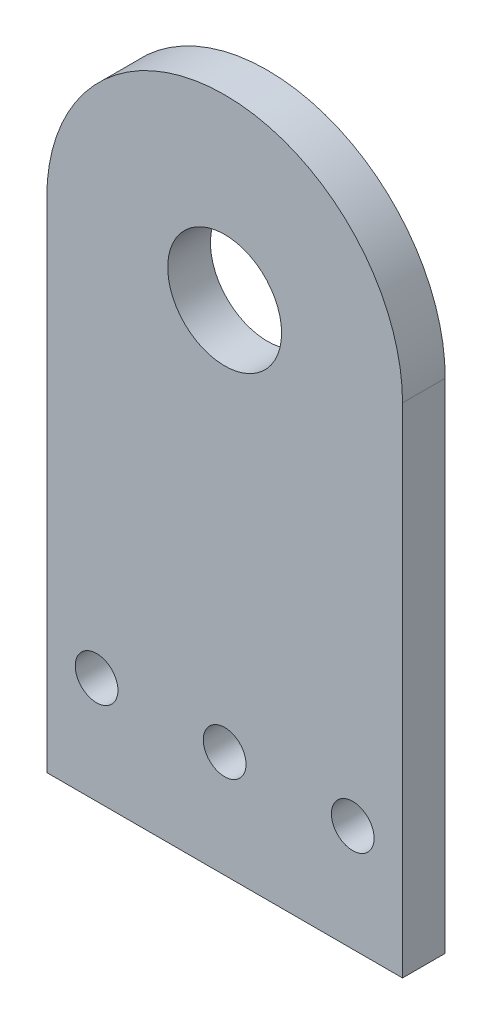
ISO-10303-21;
HEADER;
FILE_DESCRIPTION(('STEP AP214'),'2;1');
FILE_NAME('part.step','',(''),(''),'','','');
FILE_SCHEMA(('AUTOMOTIVE_DESIGN { 1 0 10303 214 1 1 1 1 }'));
ENDSEC;
DATA;
#1=APPLICATION_CONTEXT('core data for automotive mechanical design processes');
#2=APPLICATION_PROTOCOL_DEFINITION('international standard','automotive_design',2000,#1);
#3=PRODUCT_CONTEXT('',#1,'mechanical');
#4=PRODUCT('Part','Part','',(#3));
#5=PRODUCT_RELATED_PRODUCT_CATEGORY('part','',(#4));
#6=PRODUCT_DEFINITION_FORMATION('','',#4);
#7=PRODUCT_DEFINITION_CONTEXT('part definition',#1,'design');
#8=PRODUCT_DEFINITION('design','',#6,#7);
#9=PRODUCT_DEFINITION_SHAPE('','',#8);
#10=(LENGTH_UNIT() NAMED_UNIT(*) SI_UNIT(.MILLI.,.METRE.));
#11=(NAMED_UNIT(*) PLANE_ANGLE_UNIT() SI_UNIT($,.RADIAN.));
#12=(NAMED_UNIT(*) SI_UNIT($,.STERADIAN.) SOLID_ANGLE_UNIT());
#13=UNCERTAINTY_MEASURE_WITH_UNIT(LENGTH_MEASURE(1.E-05),#10,'distance_accuracy_value','');
#14=(GEOMETRIC_REPRESENTATION_CONTEXT(3) GLOBAL_UNCERTAINTY_ASSIGNED_CONTEXT((#13)) GLOBAL_UNIT_ASSIGNED_CONTEXT((#10,
#11,#12)) REPRESENTATION_CONTEXT('',''));
#15=CARTESIAN_POINT('',(0.,0.,0.));
#16=DIRECTION('',(0.,0.,1.));
#17=DIRECTION('',(1.,0.,0.));
#18=AXIS2_PLACEMENT_3D('',#15,#16,#17);
#19=CARTESIAN_POINT('',(12.5,17.5,3.));
#20=DIRECTION('',(-1.,0.,0.));
#21=DIRECTION('',(0.,-1.,0.));
#22=AXIS2_PLACEMENT_3D('',#19,#20,#21);
#23=PLANE('',#22);
#24=DIRECTION('',(0.,1.,0.));
#25=VECTOR('',#24,1.);
#26=CARTESIAN_POINT('',(12.5,17.5,0.));
#27=LINE('',#26,#25);
#28=CARTESIAN_POINT('',(12.5,-17.5,0.));
#29=VERTEX_POINT('',#28);
#30=CARTESIAN_POINT('',(12.5,17.5,0.));
#31=VERTEX_POINT('',#30);
#32=EDGE_CURVE('E99',#29,#31,#27,.T.);
#33=ORIENTED_EDGE('',*,*,#32,.T.);
#34=DIRECTION('',(0.,0.,-1.));
#35=VECTOR('',#34,1.);
#36=CARTESIAN_POINT('',(12.5,17.5,3.));
#37=LINE('',#36,#35);
#38=CARTESIAN_POINT('',(12.5,17.5,3.));
#39=VERTEX_POINT('',#38);
#40=EDGE_CURVE('E11',#39,#31,#37,.T.);
#41=ORIENTED_EDGE('',*,*,#40,.F.);
#42=DIRECTION('',(0.,1.,0.));
#43=VECTOR('',#42,1.);
#44=CARTESIAN_POINT('',(12.5,17.5,3.));
#45=LINE('',#44,#43);
#46=CARTESIAN_POINT('',(12.5,-17.5,3.));
#47=VERTEX_POINT('',#46);
#48=EDGE_CURVE('E87',#47,#39,#45,.T.);
#49=ORIENTED_EDGE('',*,*,#48,.F.);
#50=DIRECTION('',(0.,0.,-1.));
#51=VECTOR('',#50,1.);
#52=CARTESIAN_POINT('',(12.5,-17.5,3.));
#53=LINE('',#52,#51);
#54=EDGE_CURVE('E95',#47,#29,#53,.T.);
#55=ORIENTED_EDGE('',*,*,#54,.T.);
#56=EDGE_LOOP('',(#33,#41,#49,#55));
#57=FACE_BOUND('',#56,.T.);
#58=ADVANCED_FACE('F36',(#57),#23,.F.);
#59=CARTESIAN_POINT('',(0.,17.5,3.));
#60=DIRECTION('',(0.,0.,-1.));
#61=DIRECTION('',(-1.,0.,0.));
#62=AXIS2_PLACEMENT_3D('',#59,#60,#61);
#63=CYLINDRICAL_SURFACE('',#62,12.5);
#64=CARTESIAN_POINT('',(0.,17.5,0.));
#65=DIRECTION('',(0.,0.,1.));
#66=DIRECTION('',(1.,0.,0.));
#67=AXIS2_PLACEMENT_3D('',#64,#65,#66);
#68=CIRCLE('',#67,12.5);
#69=CARTESIAN_POINT('',(-12.5,17.5,0.));
#70=VERTEX_POINT('',#69);
#71=EDGE_CURVE('E91',#31,#70,#68,.T.);
#72=ORIENTED_EDGE('',*,*,#71,.T.);
#73=DIRECTION('',(0.,0.,-1.));
#74=VECTOR('',#73,1.);
#75=CARTESIAN_POINT('',(-12.5,17.5,3.));
#76=LINE('',#75,#74);
#77=CARTESIAN_POINT('',(-12.5,17.5,3.));
#78=VERTEX_POINT('',#77);
#79=EDGE_CURVE('E44',#78,#70,#76,.T.);
#80=ORIENTED_EDGE('',*,*,#79,.F.);
#81=CARTESIAN_POINT('',(0.,17.5,3.));
#82=DIRECTION('',(0.,0.,1.));
#83=DIRECTION('',(1.,0.,0.));
#84=AXIS2_PLACEMENT_3D('',#81,#82,#83);
#85=CIRCLE('',#84,12.5);
#86=EDGE_CURVE('E82',#39,#78,#85,.T.);
#87=ORIENTED_EDGE('',*,*,#86,.F.);
#88=ORIENTED_EDGE('',*,*,#40,.T.);
#89=EDGE_LOOP('',(#72,#80,#87,#88));
#90=FACE_BOUND('',#89,.T.);
#91=ADVANCED_FACE('F90',(#90),#63,.T.);
#92=CARTESIAN_POINT('',(-12.5,17.5,3.));
#93=DIRECTION('',(1.,0.,0.));
#94=DIRECTION('',(0.,1.,0.));
#95=AXIS2_PLACEMENT_3D('',#92,#93,#94);
#96=PLANE('',#95);
#97=DIRECTION('',(0.,-1.,0.));
#98=VECTOR('',#97,1.);
#99=CARTESIAN_POINT('',(-12.5,17.5,0.));
#100=LINE('',#99,#98);
#101=CARTESIAN_POINT('',(-12.5,-17.5,0.));
#102=VERTEX_POINT('',#101);
#103=EDGE_CURVE('E69',#70,#102,#100,.T.);
#104=ORIENTED_EDGE('',*,*,#103,.T.);
#105=DIRECTION('',(0.,0.,-1.));
#106=VECTOR('',#105,1.);
#107=CARTESIAN_POINT('',(-12.5,-17.5,3.));
#108=LINE('',#107,#106);
#109=CARTESIAN_POINT('',(-12.5,-17.5,3.));
#110=VERTEX_POINT('',#109);
#111=EDGE_CURVE('E92',#110,#102,#108,.T.);
#112=ORIENTED_EDGE('',*,*,#111,.F.);
#113=DIRECTION('',(0.,-1.,0.));
#114=VECTOR('',#113,1.);
#115=CARTESIAN_POINT('',(-12.5,17.5,3.));
#116=LINE('',#115,#114);
#117=EDGE_CURVE('E85',#78,#110,#116,.T.);
#118=ORIENTED_EDGE('',*,*,#117,.F.);
#119=ORIENTED_EDGE('',*,*,#79,.T.);
#120=EDGE_LOOP('',(#104,#112,#118,#119));
#121=FACE_BOUND('',#120,.T.);
#122=ADVANCED_FACE('F93',(#121),#96,.F.);
#123=CARTESIAN_POINT('',(-12.5,-17.5,3.));
#124=DIRECTION('',(0.,1.,0.));
#125=DIRECTION('',(0.,0.,1.));
#126=AXIS2_PLACEMENT_3D('',#123,#124,#125);
#127=PLANE('',#126);
#128=DIRECTION('',(1.,0.,0.));
#129=VECTOR('',#128,1.);
#130=CARTESIAN_POINT('',(-12.5,-17.5,0.));
#131=LINE('',#130,#129);
#132=EDGE_CURVE('E75',#102,#29,#131,.T.);
#133=ORIENTED_EDGE('',*,*,#132,.T.);
#134=ORIENTED_EDGE('',*,*,#54,.F.);
#135=DIRECTION('',(1.,0.,0.));
#136=VECTOR('',#135,1.);
#137=CARTESIAN_POINT('',(-12.5,-17.5,3.));
#138=LINE('',#137,#136);
#139=EDGE_CURVE('E52',#110,#47,#138,.T.);
#140=ORIENTED_EDGE('',*,*,#139,.F.);
#141=ORIENTED_EDGE('',*,*,#111,.T.);
#142=EDGE_LOOP('',(#133,#134,#140,#141));
#143=FACE_BOUND('',#142,.T.);
#144=ADVANCED_FACE('F107',(#143),#127,.F.);
#145=CARTESIAN_POINT('',(0.,17.5,3.));
#146=DIRECTION('',(0.,0.,1.));
#147=DIRECTION('',(1.,0.,0.));
#148=AXIS2_PLACEMENT_3D('',#145,#146,#147);
#149=PLANE('',#148);
#150=CARTESIAN_POINT('',(-9.,-10.,3.));
#151=DIRECTION('',(0.,0.,1.));
#152=DIRECTION('',(1.,0.,0.));
#153=AXIS2_PLACEMENT_3D('',#150,#151,#152);
#154=CIRCLE('',#153,1.5);
#155=CARTESIAN_POINT('',(-7.5,-10.,3.));
#156=VERTEX_POINT('',#155);
#157=EDGE_CURVE('E131',#156,#156,#154,.T.);
#158=ORIENTED_EDGE('',*,*,#157,.F.);
#159=EDGE_LOOP('',(#158));
#160=FACE_BOUND('',#159,.T.);
#161=CARTESIAN_POINT('',(0.,-10.,3.));
#162=DIRECTION('',(0.,0.,1.));
#163=DIRECTION('',(1.,0.,0.));
#164=AXIS2_PLACEMENT_3D('',#161,#162,#163);
#165=CIRCLE('',#164,1.5);
#166=CARTESIAN_POINT('',(1.5,-10.,3.));
#167=VERTEX_POINT('',#166);
#168=EDGE_CURVE('E125',#167,#167,#165,.T.);
#169=ORIENTED_EDGE('',*,*,#168,.F.);
#170=EDGE_LOOP('',(#169));
#171=FACE_BOUND('',#170,.T.);
#172=CARTESIAN_POINT('',(9.,-10.,3.));
#173=DIRECTION('',(0.,0.,1.));
#174=DIRECTION('',(-1.,0.,0.));
#175=AXIS2_PLACEMENT_3D('',#172,#173,#174);
#176=CIRCLE('',#175,1.5);
#177=CARTESIAN_POINT('',(7.5,-10.,3.));
#178=VERTEX_POINT('',#177);
#179=EDGE_CURVE('E119',#178,#178,#176,.T.);
#180=ORIENTED_EDGE('',*,*,#179,.F.);
#181=EDGE_LOOP('',(#180));
#182=FACE_BOUND('',#181,.T.);
#183=CARTESIAN_POINT('',(0.,17.5,3.));
#184=DIRECTION('',(0.,0.,1.));
#185=DIRECTION('',(1.,0.,0.));
#186=AXIS2_PLACEMENT_3D('',#183,#184,#185);
#187=CIRCLE('',#186,4.);
#188=CARTESIAN_POINT('',(4.,17.5,3.));
#189=VERTEX_POINT('',#188);
#190=EDGE_CURVE('E113',#189,#189,#187,.T.);
#191=ORIENTED_EDGE('',*,*,#190,.F.);
#192=EDGE_LOOP('',(#191));
#193=FACE_BOUND('',#192,.T.);
#194=ORIENTED_EDGE('',*,*,#48,.T.);
#195=ORIENTED_EDGE('',*,*,#86,.T.);
#196=ORIENTED_EDGE('',*,*,#117,.T.);
#197=ORIENTED_EDGE('',*,*,#139,.T.);
#198=EDGE_LOOP('',(#194,#195,#196,#197));
#199=FACE_BOUND('',#198,.T.);
#200=ADVANCED_FACE('F83',(#160,#171,#182,#193,#199),#149,.T.);
#201=CARTESIAN_POINT('',(0.,17.5,0.));
#202=DIRECTION('',(0.,0.,1.));
#203=DIRECTION('',(1.,0.,0.));
#204=AXIS2_PLACEMENT_3D('',#201,#202,#203);
#205=PLANE('',#204);
#206=CARTESIAN_POINT('',(-9.,-10.,0.));
#207=DIRECTION('',(0.,0.,1.));
#208=DIRECTION('',(1.,0.,0.));
#209=AXIS2_PLACEMENT_3D('',#206,#207,#208);
#210=CIRCLE('',#209,1.5);
#211=CARTESIAN_POINT('',(-7.5,-10.,0.));
#212=VERTEX_POINT('',#211);
#213=EDGE_CURVE('E116',#212,#212,#210,.T.);
#214=ORIENTED_EDGE('',*,*,#213,.T.);
#215=EDGE_LOOP('',(#214));
#216=FACE_BOUND('',#215,.T.);
#217=CARTESIAN_POINT('',(0.,-10.,0.));
#218=DIRECTION('',(0.,0.,1.));
#219=DIRECTION('',(1.,0.,0.));
#220=AXIS2_PLACEMENT_3D('',#217,#218,#219);
#221=CIRCLE('',#220,1.5);
#222=CARTESIAN_POINT('',(1.5,-10.,0.));
#223=VERTEX_POINT('',#222);
#224=EDGE_CURVE('E128',#223,#223,#221,.T.);
#225=ORIENTED_EDGE('',*,*,#224,.T.);
#226=EDGE_LOOP('',(#225));
#227=FACE_BOUND('',#226,.T.);
#228=CARTESIAN_POINT('',(9.,-10.,0.));
#229=DIRECTION('',(0.,0.,1.));
#230=DIRECTION('',(-1.,0.,0.));
#231=AXIS2_PLACEMENT_3D('',#228,#229,#230);
#232=CIRCLE('',#231,1.5);
#233=CARTESIAN_POINT('',(7.5,-10.,0.));
#234=VERTEX_POINT('',#233);
#235=EDGE_CURVE('E122',#234,#234,#232,.T.);
#236=ORIENTED_EDGE('',*,*,#235,.T.);
#237=EDGE_LOOP('',(#236));
#238=FACE_BOUND('',#237,.T.);
#239=CARTESIAN_POINT('',(0.,17.5,0.));
#240=DIRECTION('',(0.,0.,1.));
#241=DIRECTION('',(1.,0.,0.));
#242=AXIS2_PLACEMENT_3D('',#239,#240,#241);
#243=CIRCLE('',#242,4.);
#244=CARTESIAN_POINT('',(4.,17.5,0.));
#245=VERTEX_POINT('',#244);
#246=EDGE_CURVE('E102',#245,#245,#243,.T.);
#247=ORIENTED_EDGE('',*,*,#246,.T.);
#248=EDGE_LOOP('',(#247));
#249=FACE_BOUND('',#248,.T.);
#250=ORIENTED_EDGE('',*,*,#32,.F.);
#251=ORIENTED_EDGE('',*,*,#132,.F.);
#252=ORIENTED_EDGE('',*,*,#103,.F.);
#253=ORIENTED_EDGE('',*,*,#71,.F.);
#254=EDGE_LOOP('',(#250,#251,#252,#253));
#255=FACE_BOUND('',#254,.T.);
#256=ADVANCED_FACE('F110',(#216,#227,#238,#249,#255),#205,.F.);
#257=CARTESIAN_POINT('',(0.,17.5,0.));
#258=DIRECTION('',(0.,0.,1.));
#259=DIRECTION('',(1.,0.,0.));
#260=AXIS2_PLACEMENT_3D('',#257,#258,#259);
#261=CYLINDRICAL_SURFACE('',#260,4.);
#262=ORIENTED_EDGE('',*,*,#246,.F.);
#263=EDGE_LOOP('',(#262));
#264=FACE_BOUND('',#263,.T.);
#265=ORIENTED_EDGE('',*,*,#190,.T.);
#266=EDGE_LOOP('',(#265));
#267=FACE_BOUND('',#266,.T.);
#268=ADVANCED_FACE('F155',(#264,#267),#261,.F.);
#269=CARTESIAN_POINT('',(9.,-10.,0.));
#270=DIRECTION('',(0.,0.,1.));
#271=DIRECTION('',(1.,0.,0.));
#272=AXIS2_PLACEMENT_3D('',#269,#270,#271);
#273=CYLINDRICAL_SURFACE('',#272,1.5);
#274=ORIENTED_EDGE('',*,*,#235,.F.);
#275=EDGE_LOOP('',(#274));
#276=FACE_BOUND('',#275,.T.);
#277=ORIENTED_EDGE('',*,*,#179,.T.);
#278=EDGE_LOOP('',(#277));
#279=FACE_BOUND('',#278,.T.);
#280=ADVANCED_FACE('F157',(#276,#279),#273,.F.);
#281=CARTESIAN_POINT('',(0.,-10.,0.));
#282=DIRECTION('',(0.,0.,1.));
#283=DIRECTION('',(1.,0.,0.));
#284=AXIS2_PLACEMENT_3D('',#281,#282,#283);
#285=CYLINDRICAL_SURFACE('',#284,1.5);
#286=ORIENTED_EDGE('',*,*,#224,.F.);
#287=EDGE_LOOP('',(#286));
#288=FACE_BOUND('',#287,.T.);
#289=ORIENTED_EDGE('',*,*,#168,.T.);
#290=EDGE_LOOP('',(#289));
#291=FACE_BOUND('',#290,.T.);
#292=ADVANCED_FACE('F142',(#288,#291),#285,.F.);
#293=CARTESIAN_POINT('',(-9.,-10.,0.));
#294=DIRECTION('',(0.,0.,1.));
#295=DIRECTION('',(1.,0.,0.));
#296=AXIS2_PLACEMENT_3D('',#293,#294,#295);
#297=CYLINDRICAL_SURFACE('',#296,1.5);
#298=ORIENTED_EDGE('',*,*,#213,.F.);
#299=EDGE_LOOP('',(#298));
#300=FACE_BOUND('',#299,.T.);
#301=ORIENTED_EDGE('',*,*,#157,.T.);
#302=EDGE_LOOP('',(#301));
#303=FACE_BOUND('',#302,.T.);
#304=ADVANCED_FACE('F139',(#300,#303),#297,.F.);
#305=CLOSED_SHELL('',(#58,#91,#122,#144,#200,#256,#268,#280,#292,#304));
#306=MANIFOLD_SOLID_BREP('B2',#305);
#307=ADVANCED_BREP_SHAPE_REPRESENTATION('',(#18,#306),#14);
#308=SHAPE_DEFINITION_REPRESENTATION(#9,#307);
ENDSEC;
END-ISO-10303-21;
